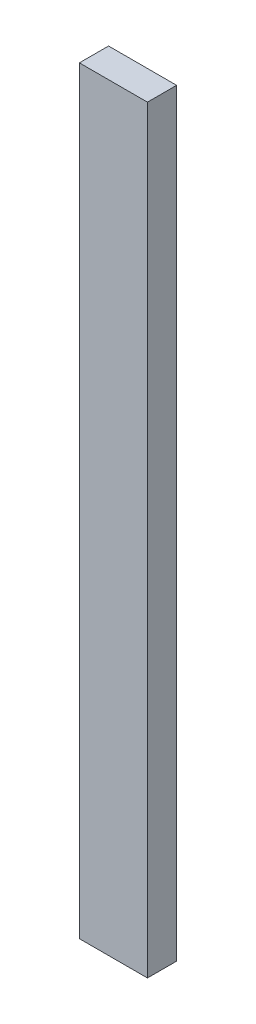
ISO-10303-21;
HEADER;
FILE_DESCRIPTION(('STEP AP214'),'2;1');
FILE_NAME('part.step','',(''),(''),'','','');
FILE_SCHEMA(('AUTOMOTIVE_DESIGN { 1 0 10303 214 1 1 1 1 }'));
ENDSEC;
DATA;
#1=APPLICATION_CONTEXT('core data for automotive mechanical design processes');
#2=APPLICATION_PROTOCOL_DEFINITION('international standard','automotive_design',2000,#1);
#3=PRODUCT_CONTEXT('',#1,'mechanical');
#4=PRODUCT('Part','Part','',(#3));
#5=PRODUCT_RELATED_PRODUCT_CATEGORY('part','',(#4));
#6=PRODUCT_DEFINITION_FORMATION('','',#4);
#7=PRODUCT_DEFINITION_CONTEXT('part definition',#1,'design');
#8=PRODUCT_DEFINITION('design','',#6,#7);
#9=PRODUCT_DEFINITION_SHAPE('','',#8);
#10=(LENGTH_UNIT() NAMED_UNIT(*) SI_UNIT(.MILLI.,.METRE.));
#11=(NAMED_UNIT(*) PLANE_ANGLE_UNIT() SI_UNIT($,.RADIAN.));
#12=(NAMED_UNIT(*) SI_UNIT($,.STERADIAN.) SOLID_ANGLE_UNIT());
#13=UNCERTAINTY_MEASURE_WITH_UNIT(LENGTH_MEASURE(1.E-05),#10,'distance_accuracy_value','');
#14=(GEOMETRIC_REPRESENTATION_CONTEXT(3) GLOBAL_UNCERTAINTY_ASSIGNED_CONTEXT((#13)) GLOBAL_UNIT_ASSIGNED_CONTEXT((#10,
#11,#12)) REPRESENTATION_CONTEXT('',''));
#15=CARTESIAN_POINT('',(0.,0.,0.));
#16=DIRECTION('',(0.,0.,1.));
#17=DIRECTION('',(1.,0.,0.));
#18=AXIS2_PLACEMENT_3D('',#15,#16,#17);
#19=CARTESIAN_POINT('',(44.45,990.6,19.05));
#20=DIRECTION('',(-1.,0.,0.));
#21=DIRECTION('',(0.,0.,1.));
#22=AXIS2_PLACEMENT_3D('',#19,#20,#21);
#23=PLANE('',#22);
#24=DIRECTION('',(0.,0.,-1.));
#25=VECTOR('',#24,1.);
#26=CARTESIAN_POINT('',(44.45,0.,19.05));
#27=LINE('',#26,#25);
#28=CARTESIAN_POINT('',(44.45,0.,19.05));
#29=VERTEX_POINT('',#28);
#30=CARTESIAN_POINT('',(44.45,0.,-19.05));
#31=VERTEX_POINT('',#30);
#32=EDGE_CURVE('E107',#29,#31,#27,.T.);
#33=ORIENTED_EDGE('',*,*,#32,.T.);
#34=DIRECTION('',(0.,-1.,0.));
#35=VECTOR('',#34,1.);
#36=CARTESIAN_POINT('',(44.45,990.6,-19.05));
#37=LINE('',#36,#35);
#38=CARTESIAN_POINT('',(44.45,990.6,-19.05));
#39=VERTEX_POINT('',#38);
#40=EDGE_CURVE('E11',#39,#31,#37,.T.);
#41=ORIENTED_EDGE('',*,*,#40,.F.);
#42=DIRECTION('',(0.,0.,-1.));
#43=VECTOR('',#42,1.);
#44=CARTESIAN_POINT('',(44.45,990.6,19.05));
#45=LINE('',#44,#43);
#46=CARTESIAN_POINT('',(44.45,990.6,19.05));
#47=VERTEX_POINT('',#46);
#48=EDGE_CURVE('E91',#47,#39,#45,.T.);
#49=ORIENTED_EDGE('',*,*,#48,.F.);
#50=DIRECTION('',(0.,-1.,0.));
#51=VECTOR('',#50,1.);
#52=CARTESIAN_POINT('',(44.45,990.6,19.05));
#53=LINE('',#52,#51);
#54=EDGE_CURVE('E103',#47,#29,#53,.T.);
#55=ORIENTED_EDGE('',*,*,#54,.T.);
#56=EDGE_LOOP('',(#33,#41,#49,#55));
#57=FACE_BOUND('',#56,.T.);
#58=ADVANCED_FACE('F39',(#57),#23,.F.);
#59=CARTESIAN_POINT('',(-44.45,990.6,-19.05));
#60=DIRECTION('',(0.,0.,1.));
#61=DIRECTION('',(1.,0.,0.));
#62=AXIS2_PLACEMENT_3D('',#59,#60,#61);
#63=PLANE('',#62);
#64=DIRECTION('',(-1.,0.,0.));
#65=VECTOR('',#64,1.);
#66=CARTESIAN_POINT('',(-44.45,0.,-19.05));
#67=LINE('',#66,#65);
#68=CARTESIAN_POINT('',(-44.45,0.,-19.05));
#69=VERTEX_POINT('',#68);
#70=EDGE_CURVE('E96',#31,#69,#67,.T.);
#71=ORIENTED_EDGE('',*,*,#70,.T.);
#72=DIRECTION('',(0.,-1.,0.));
#73=VECTOR('',#72,1.);
#74=CARTESIAN_POINT('',(-44.45,990.6,-19.05));
#75=LINE('',#74,#73);
#76=CARTESIAN_POINT('',(-44.45,990.6,-19.05));
#77=VERTEX_POINT('',#76);
#78=EDGE_CURVE('E48',#77,#69,#75,.T.);
#79=ORIENTED_EDGE('',*,*,#78,.F.);
#80=DIRECTION('',(-1.,0.,0.));
#81=VECTOR('',#80,1.);
#82=CARTESIAN_POINT('',(-44.45,990.6,-19.05));
#83=LINE('',#82,#81);
#84=EDGE_CURVE('E86',#39,#77,#83,.T.);
#85=ORIENTED_EDGE('',*,*,#84,.F.);
#86=ORIENTED_EDGE('',*,*,#40,.T.);
#87=EDGE_LOOP('',(#71,#79,#85,#86));
#88=FACE_BOUND('',#87,.T.);
#89=ADVANCED_FACE('F95',(#88),#63,.F.);
#90=CARTESIAN_POINT('',(-44.45,990.6,19.05));
#91=DIRECTION('',(1.,0.,0.));
#92=DIRECTION('',(0.,0.,-1.));
#93=AXIS2_PLACEMENT_3D('',#90,#91,#92);
#94=PLANE('',#93);
#95=DIRECTION('',(0.,0.,1.));
#96=VECTOR('',#95,1.);
#97=CARTESIAN_POINT('',(-44.45,0.,19.05));
#98=LINE('',#97,#96);
#99=CARTESIAN_POINT('',(-44.45,0.,19.05));
#100=VERTEX_POINT('',#99);
#101=EDGE_CURVE('E73',#69,#100,#98,.T.);
#102=ORIENTED_EDGE('',*,*,#101,.T.);
#103=DIRECTION('',(0.,-1.,0.));
#104=VECTOR('',#103,1.);
#105=CARTESIAN_POINT('',(-44.45,990.6,19.05));
#106=LINE('',#105,#104);
#107=CARTESIAN_POINT('',(-44.45,990.6,19.05));
#108=VERTEX_POINT('',#107);
#109=EDGE_CURVE('E98',#108,#100,#106,.T.);
#110=ORIENTED_EDGE('',*,*,#109,.F.);
#111=DIRECTION('',(0.,0.,1.));
#112=VECTOR('',#111,1.);
#113=CARTESIAN_POINT('',(-44.45,990.6,19.05));
#114=LINE('',#113,#112);
#115=EDGE_CURVE('E89',#77,#108,#114,.T.);
#116=ORIENTED_EDGE('',*,*,#115,.F.);
#117=ORIENTED_EDGE('',*,*,#78,.T.);
#118=EDGE_LOOP('',(#102,#110,#116,#117));
#119=FACE_BOUND('',#118,.T.);
#120=ADVANCED_FACE('F99',(#119),#94,.F.);
#121=CARTESIAN_POINT('',(-44.45,990.6,19.05));
#122=DIRECTION('',(0.,0.,-1.));
#123=DIRECTION('',(-1.,0.,0.));
#124=AXIS2_PLACEMENT_3D('',#121,#122,#123);
#125=PLANE('',#124);
#126=DIRECTION('',(1.,0.,0.));
#127=VECTOR('',#126,1.);
#128=CARTESIAN_POINT('',(-44.45,0.,19.05));
#129=LINE('',#128,#127);
#130=EDGE_CURVE('E79',#100,#29,#129,.T.);
#131=ORIENTED_EDGE('',*,*,#130,.T.);
#132=ORIENTED_EDGE('',*,*,#54,.F.);
#133=DIRECTION('',(1.,0.,0.));
#134=VECTOR('',#133,1.);
#135=CARTESIAN_POINT('',(-44.45,990.6,19.05));
#136=LINE('',#135,#134);
#137=EDGE_CURVE('E56',#108,#47,#136,.T.);
#138=ORIENTED_EDGE('',*,*,#137,.F.);
#139=ORIENTED_EDGE('',*,*,#109,.T.);
#140=EDGE_LOOP('',(#131,#132,#138,#139));
#141=FACE_BOUND('',#140,.T.);
#142=ADVANCED_FACE('F120',(#141),#125,.F.);
#143=CARTESIAN_POINT('',(0.,990.6,0.));
#144=DIRECTION('',(0.,-1.,0.));
#145=DIRECTION('',(0.,0.,-1.));
#146=AXIS2_PLACEMENT_3D('',#143,#144,#145);
#147=PLANE('',#146);
#148=ORIENTED_EDGE('',*,*,#48,.T.);
#149=ORIENTED_EDGE('',*,*,#84,.T.);
#150=ORIENTED_EDGE('',*,*,#115,.T.);
#151=ORIENTED_EDGE('',*,*,#137,.T.);
#152=EDGE_LOOP('',(#148,#149,#150,#151));
#153=FACE_BOUND('',#152,.T.);
#154=ADVANCED_FACE('F87',(#153),#147,.F.);
#155=CARTESIAN_POINT('',(0.,0.,0.));
#156=DIRECTION('',(0.,-1.,0.));
#157=DIRECTION('',(0.,0.,-1.));
#158=AXIS2_PLACEMENT_3D('',#155,#156,#157);
#159=PLANE('',#158);
#160=ORIENTED_EDGE('',*,*,#32,.F.);
#161=ORIENTED_EDGE('',*,*,#130,.F.);
#162=ORIENTED_EDGE('',*,*,#101,.F.);
#163=ORIENTED_EDGE('',*,*,#70,.F.);
#164=EDGE_LOOP('',(#160,#161,#162,#163));
#165=FACE_BOUND('',#164,.T.);
#166=ADVANCED_FACE('F123',(#165),#159,.T.);
#167=CLOSED_SHELL('',(#58,#89,#120,#142,#154,#166));
#168=MANIFOLD_SOLID_BREP('B2',#167);
#169=ADVANCED_BREP_SHAPE_REPRESENTATION('',(#18,#168),#14);
#170=SHAPE_DEFINITION_REPRESENTATION(#9,#169);
ENDSEC;
END-ISO-10303-21;
